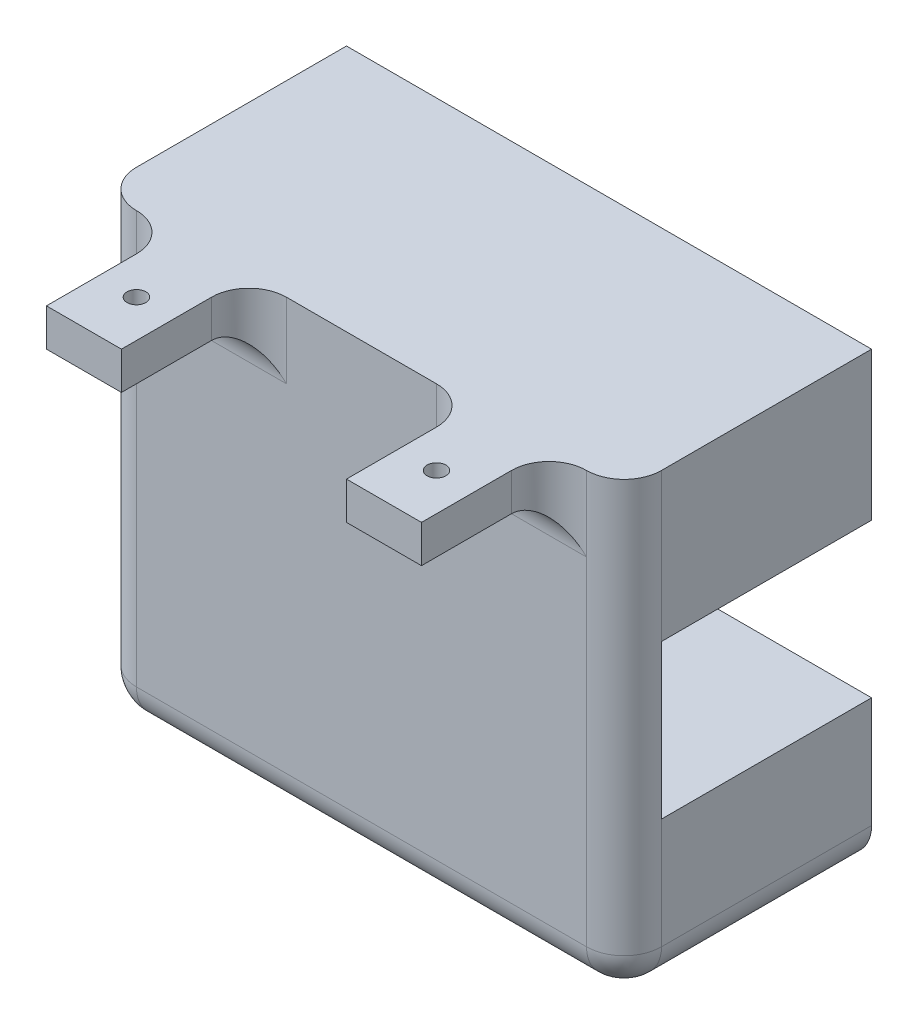
ISO-10303-21;
HEADER;
FILE_DESCRIPTION(('STEP AP214'),'2;1');
FILE_NAME('part.step','',(''),(''),'','','');
FILE_SCHEMA(('AUTOMOTIVE_DESIGN { 1 0 10303 214 1 1 1 1 }'));
ENDSEC;
DATA;
#1=APPLICATION_CONTEXT('core data for automotive mechanical design processes');
#2=APPLICATION_PROTOCOL_DEFINITION('international standard','automotive_design',2000,#1);
#3=PRODUCT_CONTEXT('',#1,'mechanical');
#4=PRODUCT('Part','Part','',(#3));
#5=PRODUCT_RELATED_PRODUCT_CATEGORY('part','',(#4));
#6=PRODUCT_DEFINITION_FORMATION('','',#4);
#7=PRODUCT_DEFINITION_CONTEXT('part definition',#1,'design');
#8=PRODUCT_DEFINITION('design','',#6,#7);
#9=PRODUCT_DEFINITION_SHAPE('','',#8);
#10=(LENGTH_UNIT() NAMED_UNIT(*) SI_UNIT(.MILLI.,.METRE.));
#11=(NAMED_UNIT(*) PLANE_ANGLE_UNIT() SI_UNIT($,.RADIAN.));
#12=(NAMED_UNIT(*) SI_UNIT($,.STERADIAN.) SOLID_ANGLE_UNIT());
#13=UNCERTAINTY_MEASURE_WITH_UNIT(LENGTH_MEASURE(1.E-05),#10,'distance_accuracy_value','');
#14=(GEOMETRIC_REPRESENTATION_CONTEXT(3) GLOBAL_UNCERTAINTY_ASSIGNED_CONTEXT((#13)) GLOBAL_UNIT_ASSIGNED_CONTEXT((#10,
#11,#12)) REPRESENTATION_CONTEXT('',''));
#15=CARTESIAN_POINT('',(0.,0.,0.));
#16=DIRECTION('',(0.,0.,1.));
#17=DIRECTION('',(1.,0.,0.));
#18=AXIS2_PLACEMENT_3D('',#15,#16,#17);
#19=CARTESIAN_POINT('',(35.,30.,33.));
#20=DIRECTION('',(-1.,0.,0.));
#21=DIRECTION('',(0.,-1.,0.));
#22=AXIS2_PLACEMENT_3D('',#19,#20,#21);
#23=PLANE('',#22);
#24=DIRECTION('',(0.,0.,-1.));
#25=VECTOR('',#24,1.);
#26=CARTESIAN_POINT('',(35.,30.,33.));
#27=LINE('',#26,#25);
#28=CARTESIAN_POINT('',(35.,30.,28.));
#29=VERTEX_POINT('',#28);
#30=CARTESIAN_POINT('',(35.,30.,0.));
#31=VERTEX_POINT('',#30);
#32=EDGE_CURVE('E293',#29,#31,#27,.T.);
#33=ORIENTED_EDGE('',*,*,#32,.F.);
#34=DIRECTION('',(0.,1.,0.));
#35=VECTOR('',#34,1.);
#36=CARTESIAN_POINT('',(35.,-30.,28.));
#37=LINE('',#36,#35);
#38=CARTESIAN_POINT('',(35.,10.25,28.));
#39=VERTEX_POINT('',#38);
#40=EDGE_CURVE('E365',#29,#39,#37,.F.);
#41=ORIENTED_EDGE('',*,*,#40,.T.);
#42=DIRECTION('',(0.,0.,-1.));
#43=VECTOR('',#42,1.);
#44=CARTESIAN_POINT('',(35.,10.25,28.));
#45=LINE('',#44,#43);
#46=CARTESIAN_POINT('',(35.,10.25,0.));
#47=VERTEX_POINT('',#46);
#48=EDGE_CURVE('E252',#39,#47,#45,.T.);
#49=ORIENTED_EDGE('',*,*,#48,.T.);
#50=DIRECTION('',(0.,1.,0.));
#51=VECTOR('',#50,1.);
#52=CARTESIAN_POINT('',(35.,30.,0.));
#53=LINE('',#52,#51);
#54=EDGE_CURVE('E278',#47,#31,#53,.T.);
#55=ORIENTED_EDGE('',*,*,#54,.T.);
#56=EDGE_LOOP('',(#33,#41,#49,#55));
#57=FACE_BOUND('',#56,.T.);
#58=ADVANCED_FACE('F43',(#57),#23,.F.);
#59=CARTESIAN_POINT('',(0.,0.,33.));
#60=DIRECTION('',(0.,0.,1.));
#61=DIRECTION('',(1.,0.,0.));
#62=AXIS2_PLACEMENT_3D('',#59,#60,#61);
#63=PLANE('',#62);
#64=DIRECTION('',(1.,0.,0.));
#65=VECTOR('',#64,1.);
#66=CARTESIAN_POINT('',(35.,-25.,33.));
#67=LINE('',#66,#65);
#68=CARTESIAN_POINT('',(-30.,-25.,33.));
#69=VERTEX_POINT('',#68);
#70=CARTESIAN_POINT('',(30.,-25.,33.));
#71=VERTEX_POINT('',#70);
#72=EDGE_CURVE('E352',#69,#71,#67,.T.);
#73=ORIENTED_EDGE('',*,*,#72,.T.);
#74=DIRECTION('',(0.,1.,0.));
#75=VECTOR('',#74,1.);
#76=CARTESIAN_POINT('',(30.,30.,33.));
#77=LINE('',#76,#75);
#78=CARTESIAN_POINT('',(30.,20.,33.));
#79=VERTEX_POINT('',#78);
#80=EDGE_CURVE('E354',#71,#79,#77,.T.);
#81=ORIENTED_EDGE('',*,*,#80,.T.);
#82=DIRECTION('',(-1.,0.,0.));
#83=VECTOR('',#82,1.);
#84=CARTESIAN_POINT('',(0.,20.,33.));
#85=LINE('',#84,#83);
#86=CARTESIAN_POINT('',(9.99999999999999,20.,33.));
#87=VERTEX_POINT('',#86);
#88=EDGE_CURVE('E310',#79,#87,#85,.T.);
#89=ORIENTED_EDGE('',*,*,#88,.T.);
#90=DIRECTION('',(0.,1.,0.));
#91=VECTOR('',#90,1.);
#92=CARTESIAN_POINT('',(9.99999999999998,0.,33.));
#93=LINE('',#92,#91);
#94=CARTESIAN_POINT('',(9.99999999999999,30.,33.));
#95=VERTEX_POINT('',#94);
#96=EDGE_CURVE('E314',#87,#95,#93,.T.);
#97=ORIENTED_EDGE('',*,*,#96,.T.);
#98=DIRECTION('',(-1.,0.,0.));
#99=VECTOR('',#98,1.);
#100=CARTESIAN_POINT('',(-35.,30.,33.));
#101=LINE('',#100,#99);
#102=CARTESIAN_POINT('',(-10.,30.,33.));
#103=VERTEX_POINT('',#102);
#104=EDGE_CURVE('E279',#95,#103,#101,.T.);
#105=ORIENTED_EDGE('',*,*,#104,.T.);
#106=DIRECTION('',(0.,-1.,0.));
#107=VECTOR('',#106,1.);
#108=CARTESIAN_POINT('',(-10.,0.,33.));
#109=LINE('',#108,#107);
#110=CARTESIAN_POINT('',(-10.,20.,33.));
#111=VERTEX_POINT('',#110);
#112=EDGE_CURVE('E305',#103,#111,#109,.T.);
#113=ORIENTED_EDGE('',*,*,#112,.T.);
#114=DIRECTION('',(-1.,0.,0.));
#115=VECTOR('',#114,1.);
#116=CARTESIAN_POINT('',(0.,20.,33.));
#117=LINE('',#116,#115);
#118=CARTESIAN_POINT('',(-30.,20.,33.));
#119=VERTEX_POINT('',#118);
#120=EDGE_CURVE('E295',#111,#119,#117,.T.);
#121=ORIENTED_EDGE('',*,*,#120,.T.);
#122=DIRECTION('',(0.,-1.,0.));
#123=VECTOR('',#122,1.);
#124=CARTESIAN_POINT('',(-30.,-30.,33.));
#125=LINE('',#124,#123);
#126=EDGE_CURVE('E336',#119,#69,#125,.T.);
#127=ORIENTED_EDGE('',*,*,#126,.T.);
#128=EDGE_LOOP('',(#73,#81,#89,#97,#105,#113,#121,#127));
#129=FACE_BOUND('',#128,.T.);
#130=ADVANCED_FACE('F401',(#129),#63,.T.);
#131=CARTESIAN_POINT('',(0.,0.,0.));
#132=DIRECTION('',(0.,0.,1.));
#133=DIRECTION('',(1.,0.,0.));
#134=AXIS2_PLACEMENT_3D('',#131,#132,#133);
#135=PLANE('',#134);
#136=DIRECTION('',(1.,0.,0.));
#137=VECTOR('',#136,1.);
#138=CARTESIAN_POINT('',(-35.,-30.,0.));
#139=LINE('',#138,#137);
#140=CARTESIAN_POINT('',(-30.,-30.,0.));
#141=VERTEX_POINT('',#140);
#142=CARTESIAN_POINT('',(30.,-30.,0.));
#143=VERTEX_POINT('',#142);
#144=EDGE_CURVE('E283',#141,#143,#139,.T.);
#145=ORIENTED_EDGE('',*,*,#144,.F.);
#146=CARTESIAN_POINT('',(-30.,-25.,0.));
#147=DIRECTION('',(0.,0.,1.));
#148=DIRECTION('',(1.,0.,0.));
#149=AXIS2_PLACEMENT_3D('',#146,#147,#148);
#150=CIRCLE('',#149,5.);
#151=CARTESIAN_POINT('',(-35.,-25.,0.));
#152=VERTEX_POINT('',#151);
#153=EDGE_CURVE('E52',#141,#152,#150,.F.);
#154=ORIENTED_EDGE('',*,*,#153,.T.);
#155=DIRECTION('',(0.,-1.,0.));
#156=VECTOR('',#155,1.);
#157=CARTESIAN_POINT('',(-35.,30.,0.));
#158=LINE('',#157,#156);
#159=CARTESIAN_POINT('',(-35.,30.,0.));
#160=VERTEX_POINT('',#159);
#161=EDGE_CURVE('E289',#160,#152,#158,.T.);
#162=ORIENTED_EDGE('',*,*,#161,.F.);
#163=DIRECTION('',(-1.,0.,0.));
#164=VECTOR('',#163,1.);
#165=CARTESIAN_POINT('',(-35.,30.,0.));
#166=LINE('',#165,#164);
#167=EDGE_CURVE('E286',#31,#160,#166,.T.);
#168=ORIENTED_EDGE('',*,*,#167,.F.);
#169=ORIENTED_EDGE('',*,*,#54,.F.);
#170=DIRECTION('',(1.,0.,0.));
#171=VECTOR('',#170,1.);
#172=CARTESIAN_POINT('',(-20.35,10.25,0.));
#173=LINE('',#172,#171);
#174=CARTESIAN_POINT('',(-20.35,10.25,0.));
#175=VERTEX_POINT('',#174);
#176=EDGE_CURVE('E270',#175,#47,#173,.T.);
#177=ORIENTED_EDGE('',*,*,#176,.F.);
#178=DIRECTION('',(0.,-1.,0.));
#179=VECTOR('',#178,1.);
#180=CARTESIAN_POINT('',(-20.35,10.25,0.));
#181=LINE('',#180,#179);
#182=CARTESIAN_POINT('',(-20.35,-10.25,0.));
#183=VERTEX_POINT('',#182);
#184=EDGE_CURVE('E262',#175,#183,#181,.T.);
#185=ORIENTED_EDGE('',*,*,#184,.T.);
#186=DIRECTION('',(1.,0.,0.));
#187=VECTOR('',#186,1.);
#188=CARTESIAN_POINT('',(-20.35,-10.25,0.));
#189=LINE('',#188,#187);
#190=CARTESIAN_POINT('',(35.,-10.25,0.));
#191=VERTEX_POINT('',#190);
#192=EDGE_CURVE('E258',#183,#191,#189,.T.);
#193=ORIENTED_EDGE('',*,*,#192,.T.);
#194=CARTESIAN_POINT('',(35.,-25.,0.));
#195=VERTEX_POINT('',#194);
#196=EDGE_CURVE('E284',#195,#191,#53,.T.);
#197=ORIENTED_EDGE('',*,*,#196,.F.);
#198=CARTESIAN_POINT('',(30.,-25.,0.));
#199=DIRECTION('',(0.,0.,1.));
#200=DIRECTION('',(1.,0.,0.));
#201=AXIS2_PLACEMENT_3D('',#198,#199,#200);
#202=CIRCLE('',#201,5.);
#203=EDGE_CURVE('E367',#195,#143,#202,.F.);
#204=ORIENTED_EDGE('',*,*,#203,.T.);
#205=EDGE_LOOP('',(#145,#154,#162,#168,#169,#177,#185,#193,#197,#204));
#206=FACE_BOUND('',#205,.T.);
#207=ADVANCED_FACE('F416',(#206),#135,.F.);
#208=DIRECTION('',(0.,0.,-1.));
#209=VECTOR('',#208,1.);
#210=CARTESIAN_POINT('',(35.,-10.25,28.));
#211=LINE('',#210,#209);
#212=CARTESIAN_POINT('',(35.,-10.25,28.));
#213=VERTEX_POINT('',#212);
#214=EDGE_CURVE('E255',#213,#191,#211,.T.);
#215=ORIENTED_EDGE('',*,*,#214,.F.);
#216=DIRECTION('',(0.,1.,0.));
#217=VECTOR('',#216,1.);
#218=CARTESIAN_POINT('',(35.,-30.,28.));
#219=LINE('',#218,#217);
#220=CARTESIAN_POINT('',(35.,-25.,28.));
#221=VERTEX_POINT('',#220);
#222=EDGE_CURVE('E363',#213,#221,#219,.F.);
#223=ORIENTED_EDGE('',*,*,#222,.T.);
#224=DIRECTION('',(0.,0.,-1.));
#225=VECTOR('',#224,1.);
#226=CARTESIAN_POINT('',(35.,-25.,33.));
#227=LINE('',#226,#225);
#228=EDGE_CURVE('E361',#221,#195,#227,.T.);
#229=ORIENTED_EDGE('',*,*,#228,.T.);
#230=ORIENTED_EDGE('',*,*,#196,.T.);
#231=EDGE_LOOP('',(#215,#223,#229,#230));
#232=FACE_BOUND('',#231,.T.);
#233=ADVANCED_FACE('F438',(#232),#23,.F.);
#234=CARTESIAN_POINT('',(-35.,30.,33.));
#235=DIRECTION('',(0.,-1.,0.));
#236=DIRECTION('',(0.,0.,-1.));
#237=AXIS2_PLACEMENT_3D('',#234,#235,#236);
#238=PLANE('',#237);
#239=CARTESIAN_POINT('',(-20.,30.,43.));
#240=DIRECTION('',(0.,1.,0.));
#241=DIRECTION('',(0.,0.,1.));
#242=AXIS2_PLACEMENT_3D('',#239,#240,#241);
#243=CIRCLE('',#242,1.24999999999999);
#244=CARTESIAN_POINT('',(-20.,30.,44.25));
#245=VERTEX_POINT('',#244);
#246=EDGE_CURVE('E303',#245,#245,#243,.T.);
#247=ORIENTED_EDGE('',*,*,#246,.F.);
#248=EDGE_LOOP('',(#247));
#249=FACE_BOUND('',#248,.T.);
#250=CARTESIAN_POINT('',(20.,30.,43.));
#251=DIRECTION('',(0.,1.,0.));
#252=DIRECTION('',(0.,0.,1.));
#253=AXIS2_PLACEMENT_3D('',#250,#251,#252);
#254=CIRCLE('',#253,1.24999999999999);
#255=CARTESIAN_POINT('',(20.,30.,44.25));
#256=VERTEX_POINT('',#255);
#257=EDGE_CURVE('E299',#256,#256,#254,.T.);
#258=ORIENTED_EDGE('',*,*,#257,.F.);
#259=EDGE_LOOP('',(#258));
#260=FACE_BOUND('',#259,.T.);
#261=CARTESIAN_POINT('',(30.,30.,38.));
#262=DIRECTION('',(0.,-1.,0.));
#263=DIRECTION('',(0.,0.,-1.));
#264=AXIS2_PLACEMENT_3D('',#261,#262,#263);
#265=CIRCLE('',#264,5.);
#266=CARTESIAN_POINT('',(25.,30.,38.));
#267=VERTEX_POINT('',#266);
#268=CARTESIAN_POINT('',(30.,30.,33.));
#269=VERTEX_POINT('',#268);
#270=EDGE_CURVE('E334',#267,#269,#265,.T.);
#271=ORIENTED_EDGE('',*,*,#270,.T.);
#272=CARTESIAN_POINT('',(30.,30.,28.));
#273=DIRECTION('',(0.,-1.,0.));
#274=DIRECTION('',(0.,0.,-1.));
#275=AXIS2_PLACEMENT_3D('',#272,#273,#274);
#276=CIRCLE('',#275,5.);
#277=EDGE_CURVE('E359',#269,#29,#276,.F.);
#278=ORIENTED_EDGE('',*,*,#277,.T.);
#279=ORIENTED_EDGE('',*,*,#32,.T.);
#280=ORIENTED_EDGE('',*,*,#167,.T.);
#281=DIRECTION('',(0.,0.,-1.));
#282=VECTOR('',#281,1.);
#283=CARTESIAN_POINT('',(-35.,30.,33.));
#284=LINE('',#283,#282);
#285=CARTESIAN_POINT('',(-35.,30.,28.));
#286=VERTEX_POINT('',#285);
#287=EDGE_CURVE('E282',#286,#160,#284,.T.);
#288=ORIENTED_EDGE('',*,*,#287,.F.);
#289=CARTESIAN_POINT('',(-30.,30.,28.));
#290=DIRECTION('',(0.,-1.,0.));
#291=DIRECTION('',(0.,0.,-1.));
#292=AXIS2_PLACEMENT_3D('',#289,#290,#291);
#293=CIRCLE('',#292,5.);
#294=CARTESIAN_POINT('',(-30.,30.,33.));
#295=VERTEX_POINT('',#294);
#296=EDGE_CURVE('E357',#286,#295,#293,.F.);
#297=ORIENTED_EDGE('',*,*,#296,.T.);
#298=CARTESIAN_POINT('',(-30.,30.,38.));
#299=DIRECTION('',(0.,-1.,0.));
#300=DIRECTION('',(0.,0.,-1.));
#301=AXIS2_PLACEMENT_3D('',#298,#299,#300);
#302=CIRCLE('',#301,5.);
#303=CARTESIAN_POINT('',(-25.,30.,38.));
#304=VERTEX_POINT('',#303);
#305=EDGE_CURVE('E328',#295,#304,#302,.T.);
#306=ORIENTED_EDGE('',*,*,#305,.T.);
#307=DIRECTION('',(0.,0.,-1.));
#308=VECTOR('',#307,1.);
#309=CARTESIAN_POINT('',(-25.,30.,50.));
#310=LINE('',#309,#308);
#311=CARTESIAN_POINT('',(-25.,30.,50.));
#312=VERTEX_POINT('',#311);
#313=EDGE_CURVE('E246',#312,#304,#310,.T.);
#314=ORIENTED_EDGE('',*,*,#313,.F.);
#315=DIRECTION('',(-1.,0.,0.));
#316=VECTOR('',#315,1.);
#317=CARTESIAN_POINT('',(-15.,30.,50.));
#318=LINE('',#317,#316);
#319=CARTESIAN_POINT('',(-15.,30.,50.));
#320=VERTEX_POINT('',#319);
#321=EDGE_CURVE('E223',#320,#312,#318,.T.);
#322=ORIENTED_EDGE('',*,*,#321,.F.);
#323=DIRECTION('',(0.,0.,-1.));
#324=VECTOR('',#323,1.);
#325=CARTESIAN_POINT('',(-15.,30.,50.));
#326=LINE('',#325,#324);
#327=CARTESIAN_POINT('',(-15.,30.,38.));
#328=VERTEX_POINT('',#327);
#329=EDGE_CURVE('E237',#320,#328,#326,.T.);
#330=ORIENTED_EDGE('',*,*,#329,.T.);
#331=CARTESIAN_POINT('',(-10.,30.,38.));
#332=DIRECTION('',(0.,-1.,0.));
#333=DIRECTION('',(0.,0.,-1.));
#334=AXIS2_PLACEMENT_3D('',#331,#332,#333);
#335=CIRCLE('',#334,5.);
#336=EDGE_CURVE('E332',#328,#103,#335,.T.);
#337=ORIENTED_EDGE('',*,*,#336,.T.);
#338=ORIENTED_EDGE('',*,*,#104,.F.);
#339=CARTESIAN_POINT('',(10.,30.,38.));
#340=DIRECTION('',(0.,-1.,0.));
#341=DIRECTION('',(0.,0.,-1.));
#342=AXIS2_PLACEMENT_3D('',#339,#340,#341);
#343=CIRCLE('',#342,5.);
#344=CARTESIAN_POINT('',(15.,30.,38.));
#345=VERTEX_POINT('',#344);
#346=EDGE_CURVE('E330',#95,#345,#343,.T.);
#347=ORIENTED_EDGE('',*,*,#346,.T.);
#348=DIRECTION('',(0.,0.,-1.));
#349=VECTOR('',#348,1.);
#350=CARTESIAN_POINT('',(15.,30.,50.));
#351=LINE('',#350,#349);
#352=CARTESIAN_POINT('',(15.,30.,50.));
#353=VERTEX_POINT('',#352);
#354=EDGE_CURVE('E222',#353,#345,#351,.T.);
#355=ORIENTED_EDGE('',*,*,#354,.F.);
#356=DIRECTION('',(-1.,0.,0.));
#357=VECTOR('',#356,1.);
#358=CARTESIAN_POINT('',(25.,30.,50.));
#359=LINE('',#358,#357);
#360=CARTESIAN_POINT('',(25.,30.,50.));
#361=VERTEX_POINT('',#360);
#362=EDGE_CURVE('E203',#361,#353,#359,.T.);
#363=ORIENTED_EDGE('',*,*,#362,.F.);
#364=DIRECTION('',(0.,0.,-1.));
#365=VECTOR('',#364,1.);
#366=CARTESIAN_POINT('',(25.,30.,50.));
#367=LINE('',#366,#365);
#368=EDGE_CURVE('E210',#361,#267,#367,.T.);
#369=ORIENTED_EDGE('',*,*,#368,.T.);
#370=EDGE_LOOP('',(#271,#278,#279,#280,#288,#297,#306,#314,#322,#330,#337,#338,#347,#355,#363,#369));
#371=FACE_BOUND('',#370,.T.);
#372=ADVANCED_FACE('F220',(#249,#260,#371),#238,.F.);
#373=CARTESIAN_POINT('',(-35.,30.,33.));
#374=DIRECTION('',(1.,0.,0.));
#375=DIRECTION('',(0.,1.,0.));
#376=AXIS2_PLACEMENT_3D('',#373,#374,#375);
#377=PLANE('',#376);
#378=ORIENTED_EDGE('',*,*,#161,.T.);
#379=DIRECTION('',(0.,0.,-1.));
#380=VECTOR('',#379,1.);
#381=CARTESIAN_POINT('',(-35.,-25.,33.));
#382=LINE('',#381,#380);
#383=CARTESIAN_POINT('',(-35.,-25.,28.));
#384=VERTEX_POINT('',#383);
#385=EDGE_CURVE('E11',#152,#384,#382,.F.);
#386=ORIENTED_EDGE('',*,*,#385,.T.);
#387=DIRECTION('',(0.,-1.,0.));
#388=VECTOR('',#387,1.);
#389=CARTESIAN_POINT('',(-35.,30.,28.));
#390=LINE('',#389,#388);
#391=EDGE_CURVE('E374',#384,#286,#390,.F.);
#392=ORIENTED_EDGE('',*,*,#391,.T.);
#393=ORIENTED_EDGE('',*,*,#287,.T.);
#394=EDGE_LOOP('',(#378,#386,#392,#393));
#395=FACE_BOUND('',#394,.T.);
#396=ADVANCED_FACE('F413',(#395),#377,.F.);
#397=CARTESIAN_POINT('',(-35.,-30.,33.));
#398=DIRECTION('',(0.,1.,0.));
#399=DIRECTION('',(0.,0.,1.));
#400=AXIS2_PLACEMENT_3D('',#397,#398,#399);
#401=PLANE('',#400);
#402=DIRECTION('',(1.,0.,0.));
#403=VECTOR('',#402,1.);
#404=CARTESIAN_POINT('',(-35.,-30.,28.));
#405=LINE('',#404,#403);
#406=CARTESIAN_POINT('',(30.,-30.,28.));
#407=VERTEX_POINT('',#406);
#408=CARTESIAN_POINT('',(-30.,-30.,28.));
#409=VERTEX_POINT('',#408);
#410=EDGE_CURVE('E370',#407,#409,#405,.F.);
#411=ORIENTED_EDGE('',*,*,#410,.T.);
#412=DIRECTION('',(0.,0.,-1.));
#413=VECTOR('',#412,1.);
#414=CARTESIAN_POINT('',(-30.,-30.,33.));
#415=LINE('',#414,#413);
#416=EDGE_CURVE('E66',#409,#141,#415,.T.);
#417=ORIENTED_EDGE('',*,*,#416,.T.);
#418=ORIENTED_EDGE('',*,*,#144,.T.);
#419=DIRECTION('',(0.,0.,-1.));
#420=VECTOR('',#419,1.);
#421=CARTESIAN_POINT('',(30.,-30.,33.));
#422=LINE('',#421,#420);
#423=EDGE_CURVE('E372',#143,#407,#422,.F.);
#424=ORIENTED_EDGE('',*,*,#423,.T.);
#425=EDGE_LOOP('',(#411,#417,#418,#424));
#426=FACE_BOUND('',#425,.T.);
#427=ADVANCED_FACE('F452',(#426),#401,.F.);
#428=CARTESIAN_POINT('',(-20.35,-10.25,28.));
#429=DIRECTION('',(0.,1.,0.));
#430=DIRECTION('',(0.,0.,1.));
#431=AXIS2_PLACEMENT_3D('',#428,#429,#430);
#432=PLANE('',#431);
#433=ORIENTED_EDGE('',*,*,#192,.F.);
#434=DIRECTION('',(0.,0.,-1.));
#435=VECTOR('',#434,1.);
#436=CARTESIAN_POINT('',(-20.35,-10.25,28.));
#437=LINE('',#436,#435);
#438=CARTESIAN_POINT('',(-20.35,-10.25,28.));
#439=VERTEX_POINT('',#438);
#440=EDGE_CURVE('E267',#439,#183,#437,.T.);
#441=ORIENTED_EDGE('',*,*,#440,.F.);
#442=DIRECTION('',(1.,0.,0.));
#443=VECTOR('',#442,1.);
#444=CARTESIAN_POINT('',(-20.35,-10.25,28.));
#445=LINE('',#444,#443);
#446=EDGE_CURVE('E259',#439,#213,#445,.T.);
#447=ORIENTED_EDGE('',*,*,#446,.T.);
#448=ORIENTED_EDGE('',*,*,#214,.T.);
#449=EDGE_LOOP('',(#433,#441,#447,#448));
#450=FACE_BOUND('',#449,.T.);
#451=ADVANCED_FACE('F442',(#450),#432,.T.);
#452=CARTESIAN_POINT('',(-20.35,10.25,28.));
#453=DIRECTION('',(0.,1.,0.));
#454=DIRECTION('',(0.,0.,1.));
#455=AXIS2_PLACEMENT_3D('',#452,#453,#454);
#456=PLANE('',#455);
#457=ORIENTED_EDGE('',*,*,#176,.T.);
#458=ORIENTED_EDGE('',*,*,#48,.F.);
#459=DIRECTION('',(1.,0.,0.));
#460=VECTOR('',#459,1.);
#461=CARTESIAN_POINT('',(-20.35,10.25,28.));
#462=LINE('',#461,#460);
#463=CARTESIAN_POINT('',(-20.35,10.25,28.));
#464=VERTEX_POINT('',#463);
#465=EDGE_CURVE('E261',#464,#39,#462,.T.);
#466=ORIENTED_EDGE('',*,*,#465,.F.);
#467=DIRECTION('',(0.,0.,-1.));
#468=VECTOR('',#467,1.);
#469=CARTESIAN_POINT('',(-20.35,10.25,28.));
#470=LINE('',#469,#468);
#471=EDGE_CURVE('E276',#464,#175,#470,.T.);
#472=ORIENTED_EDGE('',*,*,#471,.T.);
#473=EDGE_LOOP('',(#457,#458,#466,#472));
#474=FACE_BOUND('',#473,.T.);
#475=ADVANCED_FACE('F427',(#474),#456,.F.);
#476=CARTESIAN_POINT('',(-20.35,10.25,28.));
#477=DIRECTION('',(1.,0.,0.));
#478=DIRECTION('',(0.,1.,0.));
#479=AXIS2_PLACEMENT_3D('',#476,#477,#478);
#480=PLANE('',#479);
#481=ORIENTED_EDGE('',*,*,#184,.F.);
#482=ORIENTED_EDGE('',*,*,#471,.F.);
#483=DIRECTION('',(0.,-1.,0.));
#484=VECTOR('',#483,1.);
#485=CARTESIAN_POINT('',(-20.35,10.25,28.));
#486=LINE('',#485,#484);
#487=EDGE_CURVE('E265',#464,#439,#486,.T.);
#488=ORIENTED_EDGE('',*,*,#487,.T.);
#489=ORIENTED_EDGE('',*,*,#440,.T.);
#490=EDGE_LOOP('',(#481,#482,#488,#489));
#491=FACE_BOUND('',#490,.T.);
#492=ADVANCED_FACE('F446',(#491),#480,.T.);
#493=CARTESIAN_POINT('',(0.,0.,28.));
#494=DIRECTION('',(0.,0.,-1.));
#495=DIRECTION('',(-1.,0.,0.));
#496=AXIS2_PLACEMENT_3D('',#493,#494,#495);
#497=PLANE('',#496);
#498=ORIENTED_EDGE('',*,*,#446,.F.);
#499=ORIENTED_EDGE('',*,*,#487,.F.);
#500=ORIENTED_EDGE('',*,*,#465,.T.);
#501=DIRECTION('',(0.,1.,0.));
#502=VECTOR('',#501,1.);
#503=CARTESIAN_POINT('',(35.,10.25,28.));
#504=LINE('',#503,#502);
#505=EDGE_CURVE('E249',#213,#39,#504,.T.);
#506=ORIENTED_EDGE('',*,*,#505,.F.);
#507=EDGE_LOOP('',(#498,#499,#500,#506));
#508=FACE_BOUND('',#507,.T.);
#509=ADVANCED_FACE('F435',(#508),#497,.T.);
#510=CARTESIAN_POINT('',(-25.,30.,50.));
#511=DIRECTION('',(1.,0.,0.));
#512=DIRECTION('',(0.,0.,-1.));
#513=AXIS2_PLACEMENT_3D('',#510,#511,#512);
#514=PLANE('',#513);
#515=ORIENTED_EDGE('',*,*,#313,.T.);
#516=DIRECTION('',(0.,1.,0.));
#517=VECTOR('',#516,1.);
#518=CARTESIAN_POINT('',(-25.,30.,38.));
#519=LINE('',#518,#517);
#520=CARTESIAN_POINT('',(-25.,25.,38.));
#521=VERTEX_POINT('',#520);
#522=EDGE_CURVE('E317',#304,#521,#519,.F.);
#523=ORIENTED_EDGE('',*,*,#522,.T.);
#524=DIRECTION('',(0.,0.,-1.));
#525=VECTOR('',#524,1.);
#526=CARTESIAN_POINT('',(-25.,25.,50.));
#527=LINE('',#526,#525);
#528=CARTESIAN_POINT('',(-25.,25.,50.));
#529=VERTEX_POINT('',#528);
#530=EDGE_CURVE('E243',#529,#521,#527,.T.);
#531=ORIENTED_EDGE('',*,*,#530,.F.);
#532=DIRECTION('',(0.,-1.,0.));
#533=VECTOR('',#532,1.);
#534=CARTESIAN_POINT('',(-25.,30.,50.));
#535=LINE('',#534,#533);
#536=EDGE_CURVE('E227',#312,#529,#535,.T.);
#537=ORIENTED_EDGE('',*,*,#536,.F.);
#538=EDGE_LOOP('',(#515,#523,#531,#537));
#539=FACE_BOUND('',#538,.T.);
#540=ADVANCED_FACE('F487',(#539),#514,.F.);
#541=CARTESIAN_POINT('',(-25.,25.,50.));
#542=DIRECTION('',(0.,1.,0.));
#543=DIRECTION('',(0.,0.,1.));
#544=AXIS2_PLACEMENT_3D('',#541,#542,#543);
#545=PLANE('',#544);
#546=CARTESIAN_POINT('',(-20.,25.,43.));
#547=DIRECTION('',(0.,1.,0.));
#548=DIRECTION('',(0.,0.,1.));
#549=AXIS2_PLACEMENT_3D('',#546,#547,#548);
#550=CIRCLE('',#549,1.24999999999999);
#551=CARTESIAN_POINT('',(-20.,25.,44.25));
#552=VERTEX_POINT('',#551);
#553=EDGE_CURVE('E300',#552,#552,#550,.T.);
#554=ORIENTED_EDGE('',*,*,#553,.T.);
#555=EDGE_LOOP('',(#554));
#556=FACE_BOUND('',#555,.T.);
#557=ORIENTED_EDGE('',*,*,#530,.T.);
#558=DIRECTION('',(-1.,0.,0.));
#559=VECTOR('',#558,1.);
#560=CARTESIAN_POINT('',(-25.,25.,38.));
#561=LINE('',#560,#559);
#562=CARTESIAN_POINT('',(-15.,25.,38.));
#563=VERTEX_POINT('',#562);
#564=EDGE_CURVE('E326',#521,#563,#561,.F.);
#565=ORIENTED_EDGE('',*,*,#564,.T.);
#566=DIRECTION('',(0.,0.,-1.));
#567=VECTOR('',#566,1.);
#568=CARTESIAN_POINT('',(-15.,25.,50.));
#569=LINE('',#568,#567);
#570=CARTESIAN_POINT('',(-15.,25.,50.));
#571=VERTEX_POINT('',#570);
#572=EDGE_CURVE('E240',#571,#563,#569,.T.);
#573=ORIENTED_EDGE('',*,*,#572,.F.);
#574=DIRECTION('',(1.,0.,0.));
#575=VECTOR('',#574,1.);
#576=CARTESIAN_POINT('',(-25.,25.,50.));
#577=LINE('',#576,#575);
#578=EDGE_CURVE('E233',#529,#571,#577,.T.);
#579=ORIENTED_EDGE('',*,*,#578,.F.);
#580=EDGE_LOOP('',(#557,#565,#573,#579));
#581=FACE_BOUND('',#580,.T.);
#582=ADVANCED_FACE('F490',(#556,#581),#545,.F.);
#583=CARTESIAN_POINT('',(-15.,25.,50.));
#584=DIRECTION('',(-1.,0.,0.));
#585=DIRECTION('',(0.,-1.,0.));
#586=AXIS2_PLACEMENT_3D('',#583,#584,#585);
#587=PLANE('',#586);
#588=ORIENTED_EDGE('',*,*,#572,.T.);
#589=DIRECTION('',(0.,-1.,0.));
#590=VECTOR('',#589,1.);
#591=CARTESIAN_POINT('',(-15.,25.,38.));
#592=LINE('',#591,#590);
#593=EDGE_CURVE('E321',#563,#328,#592,.F.);
#594=ORIENTED_EDGE('',*,*,#593,.T.);
#595=ORIENTED_EDGE('',*,*,#329,.F.);
#596=DIRECTION('',(0.,1.,0.));
#597=VECTOR('',#596,1.);
#598=CARTESIAN_POINT('',(-15.,25.,50.));
#599=LINE('',#598,#597);
#600=EDGE_CURVE('E235',#571,#320,#599,.T.);
#601=ORIENTED_EDGE('',*,*,#600,.F.);
#602=EDGE_LOOP('',(#588,#594,#595,#601));
#603=FACE_BOUND('',#602,.T.);
#604=ADVANCED_FACE('F494',(#603),#587,.F.);
#605=CARTESIAN_POINT('',(0.,0.,50.));
#606=DIRECTION('',(0.,0.,1.));
#607=DIRECTION('',(1.,0.,0.));
#608=AXIS2_PLACEMENT_3D('',#605,#606,#607);
#609=PLANE('',#608);
#610=ORIENTED_EDGE('',*,*,#321,.T.);
#611=ORIENTED_EDGE('',*,*,#536,.T.);
#612=ORIENTED_EDGE('',*,*,#578,.T.);
#613=ORIENTED_EDGE('',*,*,#600,.T.);
#614=EDGE_LOOP('',(#610,#611,#612,#613));
#615=FACE_BOUND('',#614,.T.);
#616=ADVANCED_FACE('F498',(#615),#609,.T.);
#617=CARTESIAN_POINT('',(15.,30.,50.));
#618=DIRECTION('',(1.,0.,0.));
#619=DIRECTION('',(0.,1.,0.));
#620=AXIS2_PLACEMENT_3D('',#617,#618,#619);
#621=PLANE('',#620);
#622=ORIENTED_EDGE('',*,*,#354,.T.);
#623=DIRECTION('',(0.,1.,0.));
#624=VECTOR('',#623,1.);
#625=CARTESIAN_POINT('',(15.,30.,38.));
#626=LINE('',#625,#624);
#627=CARTESIAN_POINT('',(15.,25.,38.));
#628=VERTEX_POINT('',#627);
#629=EDGE_CURVE('E319',#345,#628,#626,.F.);
#630=ORIENTED_EDGE('',*,*,#629,.T.);
#631=DIRECTION('',(0.,0.,-1.));
#632=VECTOR('',#631,1.);
#633=CARTESIAN_POINT('',(15.,25.,50.));
#634=LINE('',#633,#632);
#635=CARTESIAN_POINT('',(15.,25.,50.));
#636=VERTEX_POINT('',#635);
#637=EDGE_CURVE('E558',#636,#628,#634,.T.);
#638=ORIENTED_EDGE('',*,*,#637,.F.);
#639=DIRECTION('',(0.,-1.,0.));
#640=VECTOR('',#639,1.);
#641=CARTESIAN_POINT('',(15.,30.,50.));
#642=LINE('',#641,#640);
#643=EDGE_CURVE('E224',#353,#636,#642,.T.);
#644=ORIENTED_EDGE('',*,*,#643,.F.);
#645=EDGE_LOOP('',(#622,#630,#638,#644));
#646=FACE_BOUND('',#645,.T.);
#647=ADVANCED_FACE('F502',(#646),#621,.F.);
#648=CARTESIAN_POINT('',(15.,25.,50.));
#649=DIRECTION('',(0.,1.,0.));
#650=DIRECTION('',(-1.,0.,0.));
#651=AXIS2_PLACEMENT_3D('',#648,#649,#650);
#652=PLANE('',#651);
#653=CARTESIAN_POINT('',(20.,25.,43.));
#654=DIRECTION('',(0.,1.,0.));
#655=DIRECTION('',(-1.,0.,0.));
#656=AXIS2_PLACEMENT_3D('',#653,#654,#655);
#657=CIRCLE('',#656,1.24999999999999);
#658=CARTESIAN_POINT('',(18.75,25.,43.));
#659=VERTEX_POINT('',#658);
#660=EDGE_CURVE('E296',#659,#659,#657,.T.);
#661=ORIENTED_EDGE('',*,*,#660,.T.);
#662=EDGE_LOOP('',(#661));
#663=FACE_BOUND('',#662,.T.);
#664=ORIENTED_EDGE('',*,*,#637,.T.);
#665=DIRECTION('',(-1.,0.,0.));
#666=VECTOR('',#665,1.);
#667=CARTESIAN_POINT('',(15.,25.,38.));
#668=LINE('',#667,#666);
#669=CARTESIAN_POINT('',(25.,25.,38.));
#670=VERTEX_POINT('',#669);
#671=EDGE_CURVE('E324',#628,#670,#668,.F.);
#672=ORIENTED_EDGE('',*,*,#671,.T.);
#673=DIRECTION('',(0.,0.,-1.));
#674=VECTOR('',#673,1.);
#675=CARTESIAN_POINT('',(25.,25.,50.));
#676=LINE('',#675,#674);
#677=CARTESIAN_POINT('',(25.,25.,50.));
#678=VERTEX_POINT('',#677);
#679=EDGE_CURVE('E218',#678,#670,#676,.T.);
#680=ORIENTED_EDGE('',*,*,#679,.F.);
#681=DIRECTION('',(1.,0.,0.));
#682=VECTOR('',#681,1.);
#683=CARTESIAN_POINT('',(15.,25.,50.));
#684=LINE('',#683,#682);
#685=EDGE_CURVE('E206',#636,#678,#684,.T.);
#686=ORIENTED_EDGE('',*,*,#685,.F.);
#687=EDGE_LOOP('',(#664,#672,#680,#686));
#688=FACE_BOUND('',#687,.T.);
#689=ADVANCED_FACE('F509',(#663,#688),#652,.F.);
#690=CARTESIAN_POINT('',(25.,25.,50.));
#691=DIRECTION('',(-1.,0.,0.));
#692=DIRECTION('',(0.,-1.,0.));
#693=AXIS2_PLACEMENT_3D('',#690,#691,#692);
#694=PLANE('',#693);
#695=ORIENTED_EDGE('',*,*,#679,.T.);
#696=DIRECTION('',(0.,-1.,0.));
#697=VECTOR('',#696,1.);
#698=CARTESIAN_POINT('',(25.,25.,38.));
#699=LINE('',#698,#697);
#700=EDGE_CURVE('E215',#670,#267,#699,.F.);
#701=ORIENTED_EDGE('',*,*,#700,.T.);
#702=ORIENTED_EDGE('',*,*,#368,.F.);
#703=DIRECTION('',(0.,1.,0.));
#704=VECTOR('',#703,1.);
#705=CARTESIAN_POINT('',(25.,25.,50.));
#706=LINE('',#705,#704);
#707=EDGE_CURVE('E199',#678,#361,#706,.T.);
#708=ORIENTED_EDGE('',*,*,#707,.F.);
#709=EDGE_LOOP('',(#695,#701,#702,#708));
#710=FACE_BOUND('',#709,.T.);
#711=ADVANCED_FACE('F213',(#710),#694,.F.);
#712=CARTESIAN_POINT('',(0.,0.,50.));
#713=DIRECTION('',(0.,0.,1.));
#714=DIRECTION('',(1.,0.,0.));
#715=AXIS2_PLACEMENT_3D('',#712,#713,#714);
#716=PLANE('',#715);
#717=ORIENTED_EDGE('',*,*,#362,.T.);
#718=ORIENTED_EDGE('',*,*,#643,.T.);
#719=ORIENTED_EDGE('',*,*,#685,.T.);
#720=ORIENTED_EDGE('',*,*,#707,.T.);
#721=EDGE_LOOP('',(#717,#718,#719,#720));
#722=FACE_BOUND('',#721,.T.);
#723=ADVANCED_FACE('F201',(#722),#716,.T.);
#724=CARTESIAN_POINT('',(20.,30.,43.));
#725=DIRECTION('',(0.,1.,0.));
#726=DIRECTION('',(0.,0.,1.));
#727=AXIS2_PLACEMENT_3D('',#724,#725,#726);
#728=CYLINDRICAL_SURFACE('',#727,1.24999999999999);
#729=ORIENTED_EDGE('',*,*,#257,.T.);
#730=EDGE_LOOP('',(#729));
#731=FACE_BOUND('',#730,.T.);
#732=ORIENTED_EDGE('',*,*,#660,.F.);
#733=EDGE_LOOP('',(#732));
#734=FACE_BOUND('',#733,.T.);
#735=ADVANCED_FACE('F506',(#731,#734),#728,.F.);
#736=CARTESIAN_POINT('',(-20.,30.,43.));
#737=DIRECTION('',(0.,1.,0.));
#738=DIRECTION('',(0.,0.,1.));
#739=AXIS2_PLACEMENT_3D('',#736,#737,#738);
#740=CYLINDRICAL_SURFACE('',#739,1.24999999999999);
#741=ORIENTED_EDGE('',*,*,#246,.T.);
#742=EDGE_LOOP('',(#741));
#743=FACE_BOUND('',#742,.T.);
#744=ORIENTED_EDGE('',*,*,#553,.F.);
#745=EDGE_LOOP('',(#744));
#746=FACE_BOUND('',#745,.T.);
#747=ADVANCED_FACE('F518',(#743,#746),#740,.F.);
#748=CARTESIAN_POINT('',(-10.,0.,38.));
#749=DIRECTION('',(0.,-1.,0.));
#750=DIRECTION('',(1.,0.,0.));
#751=AXIS2_PLACEMENT_3D('',#748,#749,#750);
#752=CYLINDRICAL_SURFACE('',#751,5.);
#753=ORIENTED_EDGE('',*,*,#336,.F.);
#754=ORIENTED_EDGE('',*,*,#593,.F.);
#755=CARTESIAN_POINT('',(-10.,20.,38.));
#756=DIRECTION('',(-0.707106781186548,-0.707106781186547,0.));
#757=DIRECTION('',(-0.707106781186547,0.707106781186548,0.));
#758=AXIS2_PLACEMENT_3D('',#755,#756,#757);
#759=ELLIPSE('',#758,7.07106781186547,5.);
#760=EDGE_CURVE('E340',#111,#563,#759,.F.);
#761=ORIENTED_EDGE('',*,*,#760,.F.);
#762=ORIENTED_EDGE('',*,*,#112,.F.);
#763=EDGE_LOOP('',(#753,#754,#761,#762));
#764=FACE_BOUND('',#763,.T.);
#765=ADVANCED_FACE('F521',(#764),#752,.F.);
#766=CARTESIAN_POINT('',(0.,20.,38.));
#767=DIRECTION('',(-1.,0.,0.));
#768=DIRECTION('',(0.,0.,1.));
#769=AXIS2_PLACEMENT_3D('',#766,#767,#768);
#770=CYLINDRICAL_SURFACE('',#769,5.);
#771=ORIENTED_EDGE('',*,*,#760,.T.);
#772=ORIENTED_EDGE('',*,*,#564,.F.);
#773=CARTESIAN_POINT('',(-30.,20.,38.));
#774=DIRECTION('',(-0.707106781186547,0.707106781186547,0.));
#775=DIRECTION('',(-0.707106781186547,-0.707106781186547,0.));
#776=AXIS2_PLACEMENT_3D('',#773,#774,#775);
#777=ELLIPSE('',#776,7.07106781186547,5.);
#778=EDGE_CURVE('E337',#119,#521,#777,.F.);
#779=ORIENTED_EDGE('',*,*,#778,.F.);
#780=ORIENTED_EDGE('',*,*,#120,.F.);
#781=EDGE_LOOP('',(#771,#772,#779,#780));
#782=FACE_BOUND('',#781,.T.);
#783=ADVANCED_FACE('F526',(#782),#770,.F.);
#784=CARTESIAN_POINT('',(-30.,0.,38.));
#785=DIRECTION('',(0.,1.,0.));
#786=DIRECTION('',(0.,0.,1.));
#787=AXIS2_PLACEMENT_3D('',#784,#785,#786);
#788=CYLINDRICAL_SURFACE('',#787,5.);
#789=ORIENTED_EDGE('',*,*,#778,.T.);
#790=ORIENTED_EDGE('',*,*,#522,.F.);
#791=ORIENTED_EDGE('',*,*,#305,.F.);
#792=DIRECTION('',(0.,1.,0.));
#793=VECTOR('',#792,1.);
#794=CARTESIAN_POINT('',(-30.,0.,33.));
#795=LINE('',#794,#793);
#796=EDGE_CURVE('E307',#119,#295,#795,.T.);
#797=ORIENTED_EDGE('',*,*,#796,.F.);
#798=EDGE_LOOP('',(#789,#790,#791,#797));
#799=FACE_BOUND('',#798,.T.);
#800=ADVANCED_FACE('F543',(#799),#788,.F.);
#801=CARTESIAN_POINT('',(30.,0.,38.));
#802=DIRECTION('',(0.,-1.,0.));
#803=DIRECTION('',(1.,0.,0.));
#804=AXIS2_PLACEMENT_3D('',#801,#802,#803);
#805=CYLINDRICAL_SURFACE('',#804,5.);
#806=ORIENTED_EDGE('',*,*,#270,.F.);
#807=ORIENTED_EDGE('',*,*,#700,.F.);
#808=CARTESIAN_POINT('',(30.,20.,38.));
#809=DIRECTION('',(-0.707106781186548,-0.707106781186547,0.));
#810=DIRECTION('',(-0.707106781186547,0.707106781186548,0.));
#811=AXIS2_PLACEMENT_3D('',#808,#809,#810);
#812=ELLIPSE('',#811,7.07106781186547,5.);
#813=EDGE_CURVE('E341',#79,#670,#812,.F.);
#814=ORIENTED_EDGE('',*,*,#813,.F.);
#815=DIRECTION('',(0.,-1.,0.));
#816=VECTOR('',#815,1.);
#817=CARTESIAN_POINT('',(30.,0.,33.));
#818=LINE('',#817,#816);
#819=EDGE_CURVE('E312',#269,#79,#818,.T.);
#820=ORIENTED_EDGE('',*,*,#819,.F.);
#821=EDGE_LOOP('',(#806,#807,#814,#820));
#822=FACE_BOUND('',#821,.T.);
#823=ADVANCED_FACE('F570',(#822),#805,.F.);
#824=CARTESIAN_POINT('',(0.,20.,38.));
#825=DIRECTION('',(-1.,0.,0.));
#826=DIRECTION('',(0.,-1.,0.));
#827=AXIS2_PLACEMENT_3D('',#824,#825,#826);
#828=CYLINDRICAL_SURFACE('',#827,5.);
#829=ORIENTED_EDGE('',*,*,#813,.T.);
#830=ORIENTED_EDGE('',*,*,#671,.F.);
#831=CARTESIAN_POINT('',(9.99999999999999,20.,38.));
#832=DIRECTION('',(-0.707106781186547,0.707106781186548,0.));
#833=DIRECTION('',(-0.707106781186548,-0.707106781186547,0.));
#834=AXIS2_PLACEMENT_3D('',#831,#832,#833);
#835=ELLIPSE('',#834,7.07106781186548,5.);
#836=EDGE_CURVE('E344',#87,#628,#835,.F.);
#837=ORIENTED_EDGE('',*,*,#836,.F.);
#838=ORIENTED_EDGE('',*,*,#88,.F.);
#839=EDGE_LOOP('',(#829,#830,#837,#838));
#840=FACE_BOUND('',#839,.T.);
#841=ADVANCED_FACE('F565',(#840),#828,.F.);
#842=CARTESIAN_POINT('',(9.99999999999998,0.,38.));
#843=DIRECTION('',(0.,1.,0.));
#844=DIRECTION('',(-1.,0.,0.));
#845=AXIS2_PLACEMENT_3D('',#842,#843,#844);
#846=CYLINDRICAL_SURFACE('',#845,5.);
#847=ORIENTED_EDGE('',*,*,#836,.T.);
#848=ORIENTED_EDGE('',*,*,#629,.F.);
#849=ORIENTED_EDGE('',*,*,#346,.F.);
#850=ORIENTED_EDGE('',*,*,#96,.F.);
#851=EDGE_LOOP('',(#847,#848,#849,#850));
#852=FACE_BOUND('',#851,.T.);
#853=ADVANCED_FACE('F560',(#852),#846,.F.);
#854=CARTESIAN_POINT('',(-30.,0.,28.));
#855=DIRECTION('',(0.,1.,0.));
#856=DIRECTION('',(-1.,0.,0.));
#857=AXIS2_PLACEMENT_3D('',#854,#855,#856);
#858=CYLINDRICAL_SURFACE('',#857,5.);
#859=ORIENTED_EDGE('',*,*,#391,.F.);
#860=CARTESIAN_POINT('',(-30.,-25.,28.));
#861=DIRECTION('',(0.,1.,0.));
#862=DIRECTION('',(-1.,0.,0.));
#863=AXIS2_PLACEMENT_3D('',#860,#861,#862);
#864=CIRCLE('',#863,5.);
#865=EDGE_CURVE('E387',#384,#69,#864,.T.);
#866=ORIENTED_EDGE('',*,*,#865,.T.);
#867=ORIENTED_EDGE('',*,*,#126,.F.);
#868=ORIENTED_EDGE('',*,*,#796,.T.);
#869=ORIENTED_EDGE('',*,*,#296,.F.);
#870=EDGE_LOOP('',(#859,#866,#867,#868,#869));
#871=FACE_BOUND('',#870,.T.);
#872=ADVANCED_FACE('F394',(#871),#858,.T.);
#873=CARTESIAN_POINT('',(30.,-25.,33.));
#874=DIRECTION('',(0.,0.,-1.));
#875=DIRECTION('',(-1.,0.,0.));
#876=AXIS2_PLACEMENT_3D('',#873,#874,#875);
#877=CYLINDRICAL_SURFACE('',#876,5.);
#878=ORIENTED_EDGE('',*,*,#203,.F.);
#879=ORIENTED_EDGE('',*,*,#228,.F.);
#880=CARTESIAN_POINT('',(30.,-25.,28.));
#881=DIRECTION('',(0.,0.,1.));
#882=DIRECTION('',(1.,0.,0.));
#883=AXIS2_PLACEMENT_3D('',#880,#881,#882);
#884=CIRCLE('',#883,5.);
#885=EDGE_CURVE('E347',#407,#221,#884,.T.);
#886=ORIENTED_EDGE('',*,*,#885,.F.);
#887=ORIENTED_EDGE('',*,*,#423,.F.);
#888=EDGE_LOOP('',(#878,#879,#886,#887));
#889=FACE_BOUND('',#888,.T.);
#890=ADVANCED_FACE('F450',(#889),#877,.T.);
#891=CARTESIAN_POINT('',(0.,-25.,28.));
#892=DIRECTION('',(-1.,0.,0.));
#893=DIRECTION('',(0.,0.,1.));
#894=AXIS2_PLACEMENT_3D('',#891,#892,#893);
#895=CYLINDRICAL_SURFACE('',#894,5.);
#896=ORIENTED_EDGE('',*,*,#72,.F.);
#897=CARTESIAN_POINT('',(-30.,-25.,28.));
#898=DIRECTION('',(-1.,0.,0.));
#899=DIRECTION('',(0.,0.,1.));
#900=AXIS2_PLACEMENT_3D('',#897,#898,#899);
#901=CIRCLE('',#900,5.);
#902=EDGE_CURVE('E376',#69,#409,#901,.F.);
#903=ORIENTED_EDGE('',*,*,#902,.T.);
#904=ORIENTED_EDGE('',*,*,#410,.F.);
#905=CARTESIAN_POINT('',(30.,-25.,28.));
#906=DIRECTION('',(1.,0.,0.));
#907=DIRECTION('',(0.,0.,-1.));
#908=AXIS2_PLACEMENT_3D('',#905,#906,#907);
#909=CIRCLE('',#908,5.);
#910=EDGE_CURVE('E380',#71,#407,#909,.T.);
#911=ORIENTED_EDGE('',*,*,#910,.F.);
#912=EDGE_LOOP('',(#896,#903,#904,#911));
#913=FACE_BOUND('',#912,.T.);
#914=ADVANCED_FACE('F406',(#913),#895,.T.);
#915=CARTESIAN_POINT('',(30.,-25.,28.));
#916=DIRECTION('',(0.,-1.,0.));
#917=DIRECTION('',(0.,0.,-1.));
#918=AXIS2_PLACEMENT_3D('',#915,#916,#917);
#919=SPHERICAL_SURFACE('',#918,5.);
#920=ORIENTED_EDGE('',*,*,#910,.T.);
#921=ORIENTED_EDGE('',*,*,#885,.T.);
#922=CARTESIAN_POINT('',(30.,-25.,28.));
#923=DIRECTION('',(0.,-1.,0.));
#924=DIRECTION('',(0.,0.,-1.));
#925=AXIS2_PLACEMENT_3D('',#922,#923,#924);
#926=CIRCLE('',#925,5.);
#927=EDGE_CURVE('E377',#71,#221,#926,.F.);
#928=ORIENTED_EDGE('',*,*,#927,.F.);
#929=EDGE_LOOP('',(#920,#921,#928));
#930=FACE_BOUND('',#929,.T.);
#931=ADVANCED_FACE('F574',(#930),#919,.T.);
#932=CARTESIAN_POINT('',(30.,0.,28.));
#933=DIRECTION('',(0.,-1.,0.));
#934=DIRECTION('',(1.,0.,0.));
#935=AXIS2_PLACEMENT_3D('',#932,#933,#934);
#936=CYLINDRICAL_SURFACE('',#935,5.);
#937=ORIENTED_EDGE('',*,*,#505,.T.);
#938=ORIENTED_EDGE('',*,*,#40,.F.);
#939=ORIENTED_EDGE('',*,*,#277,.F.);
#940=ORIENTED_EDGE('',*,*,#819,.T.);
#941=ORIENTED_EDGE('',*,*,#80,.F.);
#942=ORIENTED_EDGE('',*,*,#927,.T.);
#943=ORIENTED_EDGE('',*,*,#222,.F.);
#944=EDGE_LOOP('',(#937,#938,#939,#940,#941,#942,#943));
#945=FACE_BOUND('',#944,.T.);
#946=ADVANCED_FACE('F431',(#945),#936,.T.);
#947=CARTESIAN_POINT('',(-30.,-25.,33.));
#948=DIRECTION('',(0.,0.,-1.));
#949=DIRECTION('',(-1.,0.,0.));
#950=AXIS2_PLACEMENT_3D('',#947,#948,#949);
#951=CYLINDRICAL_SURFACE('',#950,5.);
#952=ORIENTED_EDGE('',*,*,#153,.F.);
#953=ORIENTED_EDGE('',*,*,#416,.F.);
#954=CARTESIAN_POINT('',(-30.,-25.,28.));
#955=DIRECTION('',(0.,0.,1.));
#956=DIRECTION('',(1.,0.,0.));
#957=AXIS2_PLACEMENT_3D('',#954,#955,#956);
#958=CIRCLE('',#957,5.);
#959=EDGE_CURVE('E47',#384,#409,#958,.T.);
#960=ORIENTED_EDGE('',*,*,#959,.F.);
#961=ORIENTED_EDGE('',*,*,#385,.F.);
#962=EDGE_LOOP('',(#952,#953,#960,#961));
#963=FACE_BOUND('',#962,.T.);
#964=ADVANCED_FACE('F45',(#963),#951,.T.);
#965=CARTESIAN_POINT('',(-30.,-25.,28.));
#966=DIRECTION('',(0.,0.,1.));
#967=DIRECTION('',(1.,0.,0.));
#968=AXIS2_PLACEMENT_3D('',#965,#966,#967);
#969=SPHERICAL_SURFACE('',#968,5.);
#970=ORIENTED_EDGE('',*,*,#902,.F.);
#971=ORIENTED_EDGE('',*,*,#865,.F.);
#972=ORIENTED_EDGE('',*,*,#959,.T.);
#973=EDGE_LOOP('',(#970,#971,#972));
#974=FACE_BOUND('',#973,.T.);
#975=ADVANCED_FACE('F409',(#974),#969,.T.);
#976=CLOSED_SHELL('',(#58,#130,#207,#233,#372,#396,#427,#451,#475,#492,#509,#540,#582,#604,#616,
#647,#689,#711,#723,#735,#747,#765,#783,#800,#823,#841,#853,#872,#890,#914,#931,#946,#964,#975));
#977=MANIFOLD_SOLID_BREP('B2',#976);
#978=ADVANCED_BREP_SHAPE_REPRESENTATION('',(#18,#977),#14);
#979=SHAPE_DEFINITION_REPRESENTATION(#9,#978);
ENDSEC;
END-ISO-10303-21;
